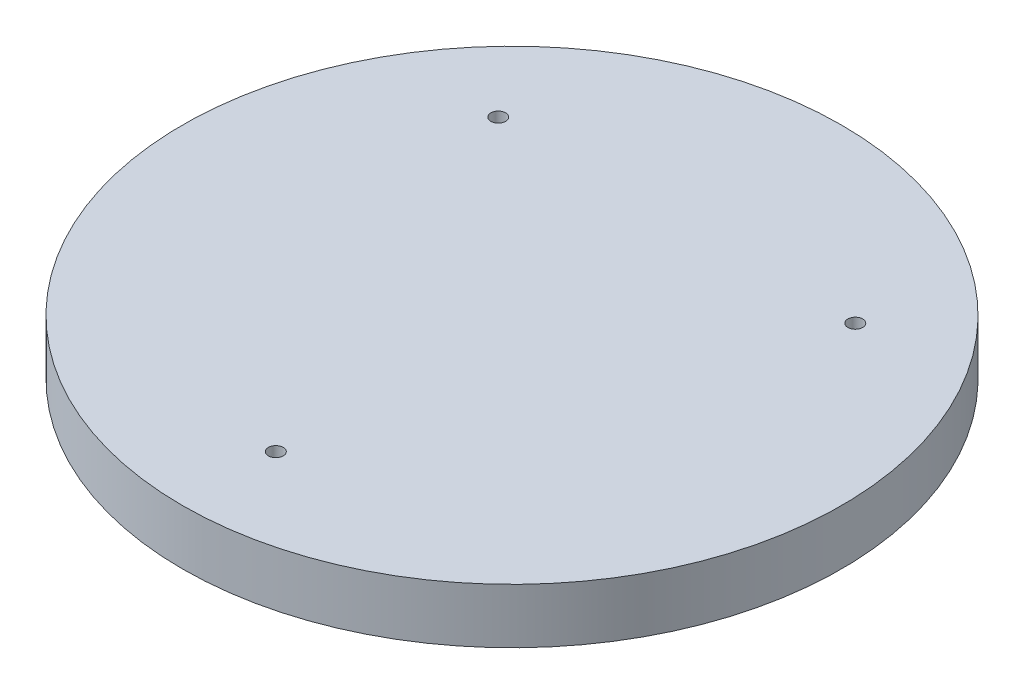
ISO-10303-21;
HEADER;
FILE_DESCRIPTION(('STEP AP214'),'2;1');
FILE_NAME('part.step','',(''),(''),'','','');
FILE_SCHEMA(('AUTOMOTIVE_DESIGN { 1 0 10303 214 1 1 1 1 }'));
ENDSEC;
DATA;
#1=APPLICATION_CONTEXT('core data for automotive mechanical design processes');
#2=APPLICATION_PROTOCOL_DEFINITION('international standard','automotive_design',2000,#1);
#3=PRODUCT_CONTEXT('',#1,'mechanical');
#4=PRODUCT('Part','Part','',(#3));
#5=PRODUCT_RELATED_PRODUCT_CATEGORY('part','',(#4));
#6=PRODUCT_DEFINITION_FORMATION('','',#4);
#7=PRODUCT_DEFINITION_CONTEXT('part definition',#1,'design');
#8=PRODUCT_DEFINITION('design','',#6,#7);
#9=PRODUCT_DEFINITION_SHAPE('','',#8);
#10=(LENGTH_UNIT() NAMED_UNIT(*) SI_UNIT(.MILLI.,.METRE.));
#11=(NAMED_UNIT(*) PLANE_ANGLE_UNIT() SI_UNIT($,.RADIAN.));
#12=(NAMED_UNIT(*) SI_UNIT($,.STERADIAN.) SOLID_ANGLE_UNIT());
#13=UNCERTAINTY_MEASURE_WITH_UNIT(LENGTH_MEASURE(1.E-05),#10,'distance_accuracy_value','');
#14=(GEOMETRIC_REPRESENTATION_CONTEXT(3) GLOBAL_UNCERTAINTY_ASSIGNED_CONTEXT((#13)) GLOBAL_UNIT_ASSIGNED_CONTEXT((#10,
#11,#12)) REPRESENTATION_CONTEXT('',''));
#15=CARTESIAN_POINT('',(0.,0.,0.));
#16=DIRECTION('',(0.,0.,1.));
#17=DIRECTION('',(1.,0.,0.));
#18=AXIS2_PLACEMENT_3D('',#15,#16,#17);
#19=CARTESIAN_POINT('',(0.,25.4,0.));
#20=DIRECTION('',(0.,-1.,0.));
#21=DIRECTION('',(0.,0.,-1.));
#22=AXIS2_PLACEMENT_3D('',#19,#20,#21);
#23=CYLINDRICAL_SURFACE('',#22,152.4);
#24=CARTESIAN_POINT('',(0.,25.4,0.));
#25=DIRECTION('',(0.,1.,0.));
#26=DIRECTION('',(0.,0.,1.));
#27=AXIS2_PLACEMENT_3D('',#24,#25,#26);
#28=CIRCLE('',#27,152.4);
#29=CARTESIAN_POINT('',(0.,25.4,152.4));
#30=VERTEX_POINT('',#29);
#31=EDGE_CURVE('E10',#30,#30,#28,.T.);
#32=ORIENTED_EDGE('',*,*,#31,.F.);
#33=EDGE_LOOP('',(#32));
#34=FACE_BOUND('',#33,.T.);
#35=CARTESIAN_POINT('',(0.,0.,0.));
#36=DIRECTION('',(0.,1.,0.));
#37=DIRECTION('',(0.,0.,1.));
#38=AXIS2_PLACEMENT_3D('',#35,#36,#37);
#39=CIRCLE('',#38,152.4);
#40=CARTESIAN_POINT('',(0.,0.,152.4));
#41=VERTEX_POINT('',#40);
#42=EDGE_CURVE('E33',#41,#41,#39,.T.);
#43=ORIENTED_EDGE('',*,*,#42,.T.);
#44=EDGE_LOOP('',(#43));
#45=FACE_BOUND('',#44,.T.);
#46=ADVANCED_FACE('F30',(#34,#45),#23,.T.);
#47=CARTESIAN_POINT('',(0.,25.4,0.));
#48=DIRECTION('',(0.,1.,0.));
#49=DIRECTION('',(0.,0.,1.));
#50=AXIS2_PLACEMENT_3D('',#47,#48,#49);
#51=PLANE('',#50);
#52=CARTESIAN_POINT('',(0.,25.4,109.22));
#53=DIRECTION('',(0.,1.,0.));
#54=DIRECTION('',(0.,0.,1.));
#55=AXIS2_PLACEMENT_3D('',#52,#53,#54);
#56=CIRCLE('',#55,3.429);
#57=CARTESIAN_POINT('',(0.,25.4,112.649));
#58=VERTEX_POINT('',#57);
#59=EDGE_CURVE('E54',#58,#58,#56,.T.);
#60=ORIENTED_EDGE('',*,*,#59,.F.);
#61=EDGE_LOOP('',(#60));
#62=FACE_BOUND('',#61,.T.);
#63=CARTESIAN_POINT('',(82.55,25.4,-76.2000000000001));
#64=DIRECTION('',(0.,1.,0.));
#65=DIRECTION('',(0.,0.,1.));
#66=AXIS2_PLACEMENT_3D('',#63,#64,#65);
#67=CIRCLE('',#66,3.429);
#68=CARTESIAN_POINT('',(82.55,25.4,-72.7710000000001));
#69=VERTEX_POINT('',#68);
#70=EDGE_CURVE('E48',#69,#69,#67,.T.);
#71=ORIENTED_EDGE('',*,*,#70,.F.);
#72=EDGE_LOOP('',(#71));
#73=FACE_BOUND('',#72,.T.);
#74=CARTESIAN_POINT('',(-82.55,25.4,-76.2));
#75=DIRECTION('',(0.,1.,0.));
#76=DIRECTION('',(0.,0.,1.));
#77=AXIS2_PLACEMENT_3D('',#74,#75,#76);
#78=CIRCLE('',#77,3.429);
#79=CARTESIAN_POINT('',(-82.55,25.4,-72.771));
#80=VERTEX_POINT('',#79);
#81=EDGE_CURVE('E42',#80,#80,#78,.T.);
#82=ORIENTED_EDGE('',*,*,#81,.F.);
#83=EDGE_LOOP('',(#82));
#84=FACE_BOUND('',#83,.T.);
#85=ORIENTED_EDGE('',*,*,#31,.T.);
#86=EDGE_LOOP('',(#85));
#87=FACE_BOUND('',#86,.T.);
#88=ADVANCED_FACE('F69',(#62,#73,#84,#87),#51,.T.);
#89=CARTESIAN_POINT('',(0.,0.,0.));
#90=DIRECTION('',(0.,1.,0.));
#91=DIRECTION('',(0.,0.,1.));
#92=AXIS2_PLACEMENT_3D('',#89,#90,#91);
#93=PLANE('',#92);
#94=ORIENTED_EDGE('',*,*,#42,.F.);
#95=EDGE_LOOP('',(#94));
#96=FACE_BOUND('',#95,.T.);
#97=ADVANCED_FACE('F72',(#96),#93,.F.);
#98=CARTESIAN_POINT('',(-82.55,12.7,-76.2));
#99=DIRECTION('',(0.,1.,0.));
#100=DIRECTION('',(0.,0.,1.));
#101=AXIS2_PLACEMENT_3D('',#98,#99,#100);
#102=CYLINDRICAL_SURFACE('',#101,3.429);
#103=CARTESIAN_POINT('',(-82.55,12.7,-76.2));
#104=DIRECTION('',(0.,1.,0.));
#105=DIRECTION('',(0.,0.,1.));
#106=AXIS2_PLACEMENT_3D('',#103,#104,#105);
#107=CIRCLE('',#106,3.429);
#108=CARTESIAN_POINT('',(-82.55,12.7,-72.771));
#109=VERTEX_POINT('',#108);
#110=EDGE_CURVE('E40',#109,#109,#107,.T.);
#111=ORIENTED_EDGE('',*,*,#110,.F.);
#112=EDGE_LOOP('',(#111));
#113=FACE_BOUND('',#112,.T.);
#114=ORIENTED_EDGE('',*,*,#81,.T.);
#115=EDGE_LOOP('',(#114));
#116=FACE_BOUND('',#115,.T.);
#117=ADVANCED_FACE('F78',(#113,#116),#102,.F.);
#118=CARTESIAN_POINT('',(-82.55,12.7,-76.2));
#119=DIRECTION('',(0.,1.,0.));
#120=DIRECTION('',(0.,0.,1.));
#121=AXIS2_PLACEMENT_3D('',#118,#119,#120);
#122=PLANE('',#121);
#123=ORIENTED_EDGE('',*,*,#110,.T.);
#124=EDGE_LOOP('',(#123));
#125=FACE_BOUND('',#124,.T.);
#126=ADVANCED_FACE('F80',(#125),#122,.T.);
#127=CARTESIAN_POINT('',(82.55,12.7,-76.2000000000001));
#128=DIRECTION('',(0.,1.,0.));
#129=DIRECTION('',(0.,0.,1.));
#130=AXIS2_PLACEMENT_3D('',#127,#128,#129);
#131=CYLINDRICAL_SURFACE('',#130,3.429);
#132=CARTESIAN_POINT('',(82.55,12.7,-76.2000000000001));
#133=DIRECTION('',(0.,1.,0.));
#134=DIRECTION('',(0.,0.,1.));
#135=AXIS2_PLACEMENT_3D('',#132,#133,#134);
#136=CIRCLE('',#135,3.429);
#137=CARTESIAN_POINT('',(82.55,12.7,-72.7710000000001));
#138=VERTEX_POINT('',#137);
#139=EDGE_CURVE('E45',#138,#138,#136,.T.);
#140=ORIENTED_EDGE('',*,*,#139,.F.);
#141=EDGE_LOOP('',(#140));
#142=FACE_BOUND('',#141,.T.);
#143=ORIENTED_EDGE('',*,*,#70,.T.);
#144=EDGE_LOOP('',(#143));
#145=FACE_BOUND('',#144,.T.);
#146=ADVANCED_FACE('F87',(#142,#145),#131,.F.);
#147=CARTESIAN_POINT('',(82.55,12.7,-76.2000000000001));
#148=DIRECTION('',(0.,1.,0.));
#149=DIRECTION('',(0.,0.,1.));
#150=AXIS2_PLACEMENT_3D('',#147,#148,#149);
#151=PLANE('',#150);
#152=ORIENTED_EDGE('',*,*,#139,.T.);
#153=EDGE_LOOP('',(#152));
#154=FACE_BOUND('',#153,.T.);
#155=ADVANCED_FACE('F65',(#154),#151,.T.);
#156=CARTESIAN_POINT('',(0.,12.7,109.22));
#157=DIRECTION('',(0.,1.,0.));
#158=DIRECTION('',(0.,0.,1.));
#159=AXIS2_PLACEMENT_3D('',#156,#157,#158);
#160=CYLINDRICAL_SURFACE('',#159,3.429);
#161=CARTESIAN_POINT('',(0.,12.7,109.22));
#162=DIRECTION('',(0.,1.,0.));
#163=DIRECTION('',(0.,0.,1.));
#164=AXIS2_PLACEMENT_3D('',#161,#162,#163);
#165=CIRCLE('',#164,3.429);
#166=CARTESIAN_POINT('',(0.,12.7,112.649));
#167=VERTEX_POINT('',#166);
#168=EDGE_CURVE('E51',#167,#167,#165,.T.);
#169=ORIENTED_EDGE('',*,*,#168,.F.);
#170=EDGE_LOOP('',(#169));
#171=FACE_BOUND('',#170,.T.);
#172=ORIENTED_EDGE('',*,*,#59,.T.);
#173=EDGE_LOOP('',(#172));
#174=FACE_BOUND('',#173,.T.);
#175=ADVANCED_FACE('F62',(#171,#174),#160,.F.);
#176=CARTESIAN_POINT('',(0.,12.7,109.22));
#177=DIRECTION('',(0.,1.,0.));
#178=DIRECTION('',(0.,0.,1.));
#179=AXIS2_PLACEMENT_3D('',#176,#177,#178);
#180=PLANE('',#179);
#181=ORIENTED_EDGE('',*,*,#168,.T.);
#182=EDGE_LOOP('',(#181));
#183=FACE_BOUND('',#182,.T.);
#184=ADVANCED_FACE('F60',(#183),#180,.T.);
#185=CLOSED_SHELL('',(#46,#88,#97,#117,#126,#146,#155,#175,#184));
#186=MANIFOLD_SOLID_BREP('B2',#185);
#187=ADVANCED_BREP_SHAPE_REPRESENTATION('',(#18,#186),#14);
#188=SHAPE_DEFINITION_REPRESENTATION(#9,#187);
ENDSEC;
END-ISO-10303-21;
